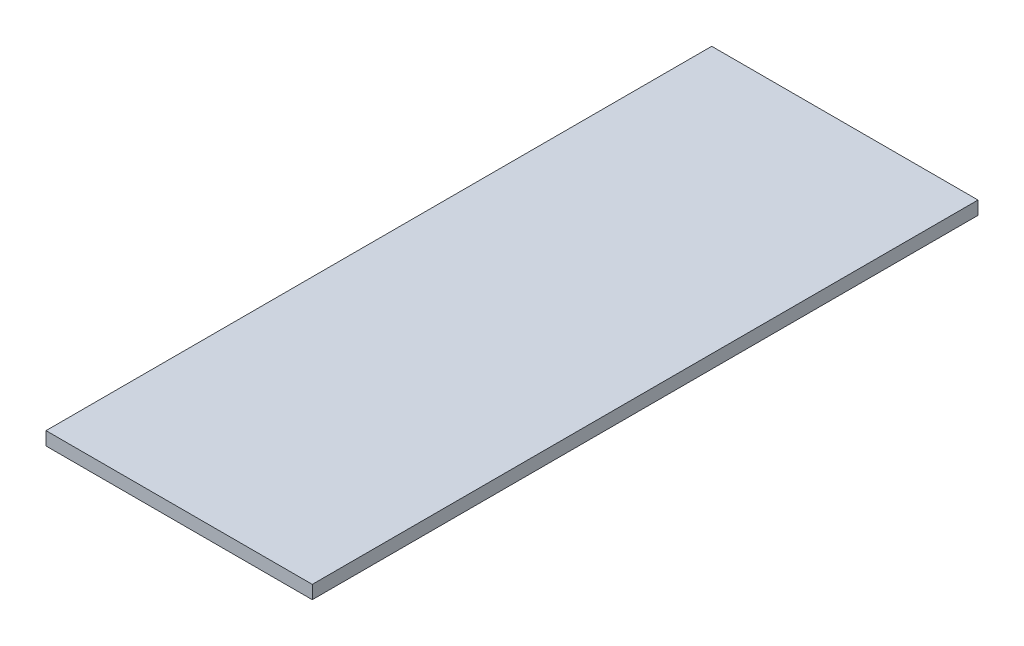
ISO-10303-21;
HEADER;
FILE_DESCRIPTION(('STEP AP214'),'2;1');
FILE_NAME('part.step','',(''),(''),'','','');
FILE_SCHEMA(('AUTOMOTIVE_DESIGN { 1 0 10303 214 1 1 1 1 }'));
ENDSEC;
DATA;
#1=APPLICATION_CONTEXT('core data for automotive mechanical design processes');
#2=APPLICATION_PROTOCOL_DEFINITION('international standard','automotive_design',2000,#1);
#3=PRODUCT_CONTEXT('',#1,'mechanical');
#4=PRODUCT('Part','Part','',(#3));
#5=PRODUCT_RELATED_PRODUCT_CATEGORY('part','',(#4));
#6=PRODUCT_DEFINITION_FORMATION('','',#4);
#7=PRODUCT_DEFINITION_CONTEXT('part definition',#1,'design');
#8=PRODUCT_DEFINITION('design','',#6,#7);
#9=PRODUCT_DEFINITION_SHAPE('','',#8);
#10=(LENGTH_UNIT() NAMED_UNIT(*) SI_UNIT(.MILLI.,.METRE.));
#11=(NAMED_UNIT(*) PLANE_ANGLE_UNIT() SI_UNIT($,.RADIAN.));
#12=(NAMED_UNIT(*) SI_UNIT($,.STERADIAN.) SOLID_ANGLE_UNIT());
#13=UNCERTAINTY_MEASURE_WITH_UNIT(LENGTH_MEASURE(1.E-05),#10,'distance_accuracy_value','');
#14=(GEOMETRIC_REPRESENTATION_CONTEXT(3) GLOBAL_UNCERTAINTY_ASSIGNED_CONTEXT((#13)) GLOBAL_UNIT_ASSIGNED_CONTEXT((#10,
#11,#12)) REPRESENTATION_CONTEXT('',''));
#15=CARTESIAN_POINT('',(0.,0.,0.));
#16=DIRECTION('',(0.,0.,1.));
#17=DIRECTION('',(1.,0.,0.));
#18=AXIS2_PLACEMENT_3D('',#15,#16,#17);
#19=CARTESIAN_POINT('',(200.,0.,-500.));
#20=DIRECTION('',(0.,1.,0.));
#21=DIRECTION('',(0.,0.,-1.));
#22=AXIS2_PLACEMENT_3D('',#19,#20,#21);
#23=CONICAL_SURFACE('',#22,20.,0.20943951023932);
#24=CARTESIAN_POINT('',(200.,0.,-500.));
#25=DIRECTION('',(0.,-1.,0.));
#26=DIRECTION('',(0.,0.,-1.));
#27=AXIS2_PLACEMENT_3D('',#24,#25,#26);
#28=CIRCLE('',#27,20.);
#29=CARTESIAN_POINT('',(200.,0.,-520.));
#30=VERTEX_POINT('',#29);
#31=EDGE_CURVE('E102',#30,#30,#28,.T.);
#32=ORIENTED_EDGE('',*,*,#31,.T.);
#33=EDGE_LOOP('',(#32));
#34=FACE_BOUND('',#33,.T.);
#35=CARTESIAN_POINT('',(200.,-48.5430515819987,-500.));
#36=DIRECTION('',(0.,-1.,0.));
#37=DIRECTION('',(0.,0.,-1.));
#38=AXIS2_PLACEMENT_3D('',#35,#36,#37);
#39=CIRCLE('',#38,9.68185586275983);
#40=CARTESIAN_POINT('',(200.,-48.5430515819987,-509.68185586276));
#41=VERTEX_POINT('',#40);
#42=EDGE_CURVE('E11',#41,#41,#39,.T.);
#43=ORIENTED_EDGE('',*,*,#42,.F.);
#44=EDGE_LOOP('',(#43));
#45=FACE_BOUND('',#44,.T.);
#46=ADVANCED_FACE('F32',(#34,#45),#23,.T.);
#47=CARTESIAN_POINT('',(0.,0.,0.));
#48=DIRECTION('',(0.,-1.,0.));
#49=DIRECTION('',(0.,0.,-1.));
#50=AXIS2_PLACEMENT_3D('',#47,#48,#49);
#51=PLANE('',#50);
#52=DIRECTION('',(0.,0.,1.));
#53=VECTOR('',#52,1.);
#54=CARTESIAN_POINT('',(0.,0.,0.));
#55=LINE('',#54,#53);
#56=CARTESIAN_POINT('',(-2.28983498828939E-13,0.,-1000.));
#57=VERTEX_POINT('',#56);
#58=CARTESIAN_POINT('',(0.,0.,0.));
#59=VERTEX_POINT('',#58);
#60=EDGE_CURVE('E99',#57,#59,#55,.T.);
#61=ORIENTED_EDGE('',*,*,#60,.F.);
#62=DIRECTION('',(-1.,0.,0.));
#63=VECTOR('',#62,1.);
#64=CARTESIAN_POINT('',(-2.28983498828939E-13,0.,-1000.));
#65=LINE('',#64,#63);
#66=CARTESIAN_POINT('',(400.,0.,-1000.));
#67=VERTEX_POINT('',#66);
#68=EDGE_CURVE('E72',#67,#57,#65,.T.);
#69=ORIENTED_EDGE('',*,*,#68,.F.);
#70=DIRECTION('',(0.,0.,-1.));
#71=VECTOR('',#70,1.);
#72=CARTESIAN_POINT('',(400.,0.,0.));
#73=LINE('',#72,#71);
#74=CARTESIAN_POINT('',(400.,0.,0.));
#75=VERTEX_POINT('',#74);
#76=EDGE_CURVE('E66',#75,#67,#73,.T.);
#77=ORIENTED_EDGE('',*,*,#76,.F.);
#78=DIRECTION('',(1.,0.,0.));
#79=VECTOR('',#78,1.);
#80=CARTESIAN_POINT('',(0.,0.,0.));
#81=LINE('',#80,#79);
#82=EDGE_CURVE('E90',#59,#75,#81,.T.);
#83=ORIENTED_EDGE('',*,*,#82,.F.);
#84=EDGE_LOOP('',(#61,#69,#77,#83));
#85=FACE_BOUND('',#84,.T.);
#86=ORIENTED_EDGE('',*,*,#31,.F.);
#87=EDGE_LOOP('',(#86));
#88=FACE_BOUND('',#87,.T.);
#89=ADVANCED_FACE('F110',(#85,#88),#51,.T.);
#90=CARTESIAN_POINT('',(0.,20.,0.));
#91=DIRECTION('',(1.,0.,0.));
#92=DIRECTION('',(0.,0.,-1.));
#93=AXIS2_PLACEMENT_3D('',#90,#91,#92);
#94=PLANE('',#93);
#95=ORIENTED_EDGE('',*,*,#60,.T.);
#96=DIRECTION('',(0.,-1.,0.));
#97=VECTOR('',#96,1.);
#98=CARTESIAN_POINT('',(0.,20.,0.));
#99=LINE('',#98,#97);
#100=CARTESIAN_POINT('',(0.,20.,0.));
#101=VERTEX_POINT('',#100);
#102=EDGE_CURVE('E41',#101,#59,#99,.T.);
#103=ORIENTED_EDGE('',*,*,#102,.F.);
#104=DIRECTION('',(0.,0.,1.));
#105=VECTOR('',#104,1.);
#106=CARTESIAN_POINT('',(0.,20.,0.));
#107=LINE('',#106,#105);
#108=CARTESIAN_POINT('',(-2.28983498828939E-13,20.,-1000.));
#109=VERTEX_POINT('',#108);
#110=EDGE_CURVE('E85',#109,#101,#107,.T.);
#111=ORIENTED_EDGE('',*,*,#110,.F.);
#112=DIRECTION('',(0.,-1.,0.));
#113=VECTOR('',#112,1.);
#114=CARTESIAN_POINT('',(-2.28983498828939E-13,20.,-1000.));
#115=LINE('',#114,#113);
#116=EDGE_CURVE('E95',#109,#57,#115,.T.);
#117=ORIENTED_EDGE('',*,*,#116,.T.);
#118=EDGE_LOOP('',(#95,#103,#111,#117));
#119=FACE_BOUND('',#118,.T.);
#120=ADVANCED_FACE('F34',(#119),#94,.F.);
#121=CARTESIAN_POINT('',(0.,20.,0.));
#122=DIRECTION('',(0.,0.,-1.));
#123=DIRECTION('',(-1.,0.,0.));
#124=AXIS2_PLACEMENT_3D('',#121,#122,#123);
#125=PLANE('',#124);
#126=ORIENTED_EDGE('',*,*,#82,.T.);
#127=DIRECTION('',(0.,-1.,0.));
#128=VECTOR('',#127,1.);
#129=CARTESIAN_POINT('',(400.,20.,0.));
#130=LINE('',#129,#128);
#131=CARTESIAN_POINT('',(400.,20.,0.));
#132=VERTEX_POINT('',#131);
#133=EDGE_CURVE('E88',#132,#75,#130,.T.);
#134=ORIENTED_EDGE('',*,*,#133,.F.);
#135=DIRECTION('',(1.,0.,0.));
#136=VECTOR('',#135,1.);
#137=CARTESIAN_POINT('',(0.,20.,0.));
#138=LINE('',#137,#136);
#139=EDGE_CURVE('E80',#101,#132,#138,.T.);
#140=ORIENTED_EDGE('',*,*,#139,.F.);
#141=ORIENTED_EDGE('',*,*,#102,.T.);
#142=EDGE_LOOP('',(#126,#134,#140,#141));
#143=FACE_BOUND('',#142,.T.);
#144=ADVANCED_FACE('F89',(#143),#125,.F.);
#145=CARTESIAN_POINT('',(400.,20.,0.));
#146=DIRECTION('',(-1.,0.,0.));
#147=DIRECTION('',(0.,0.,1.));
#148=AXIS2_PLACEMENT_3D('',#145,#146,#147);
#149=PLANE('',#148);
#150=ORIENTED_EDGE('',*,*,#76,.T.);
#151=DIRECTION('',(0.,-1.,0.));
#152=VECTOR('',#151,1.);
#153=CARTESIAN_POINT('',(400.,20.,-1000.));
#154=LINE('',#153,#152);
#155=CARTESIAN_POINT('',(400.,20.,-1000.));
#156=VERTEX_POINT('',#155);
#157=EDGE_CURVE('E91',#156,#67,#154,.T.);
#158=ORIENTED_EDGE('',*,*,#157,.F.);
#159=DIRECTION('',(0.,0.,-1.));
#160=VECTOR('',#159,1.);
#161=CARTESIAN_POINT('',(400.,20.,0.));
#162=LINE('',#161,#160);
#163=EDGE_CURVE('E83',#132,#156,#162,.T.);
#164=ORIENTED_EDGE('',*,*,#163,.F.);
#165=ORIENTED_EDGE('',*,*,#133,.T.);
#166=EDGE_LOOP('',(#150,#158,#164,#165));
#167=FACE_BOUND('',#166,.T.);
#168=ADVANCED_FACE('F93',(#167),#149,.F.);
#169=CARTESIAN_POINT('',(-2.28983498828939E-13,20.,-1000.));
#170=DIRECTION('',(0.,0.,1.));
#171=DIRECTION('',(1.,0.,0.));
#172=AXIS2_PLACEMENT_3D('',#169,#170,#171);
#173=PLANE('',#172);
#174=ORIENTED_EDGE('',*,*,#68,.T.);
#175=ORIENTED_EDGE('',*,*,#116,.F.);
#176=DIRECTION('',(-1.,0.,0.));
#177=VECTOR('',#176,1.);
#178=CARTESIAN_POINT('',(-2.28983498828939E-13,20.,-1000.));
#179=LINE('',#178,#177);
#180=EDGE_CURVE('E49',#156,#109,#179,.T.);
#181=ORIENTED_EDGE('',*,*,#180,.F.);
#182=ORIENTED_EDGE('',*,*,#157,.T.);
#183=EDGE_LOOP('',(#174,#175,#181,#182));
#184=FACE_BOUND('',#183,.T.);
#185=ADVANCED_FACE('F129',(#184),#173,.F.);
#186=CARTESIAN_POINT('',(0.,20.,0.));
#187=DIRECTION('',(0.,-1.,0.));
#188=DIRECTION('',(0.,0.,-1.));
#189=AXIS2_PLACEMENT_3D('',#186,#187,#188);
#190=PLANE('',#189);
#191=ORIENTED_EDGE('',*,*,#110,.T.);
#192=ORIENTED_EDGE('',*,*,#139,.T.);
#193=ORIENTED_EDGE('',*,*,#163,.T.);
#194=ORIENTED_EDGE('',*,*,#180,.T.);
#195=EDGE_LOOP('',(#191,#192,#193,#194));
#196=FACE_BOUND('',#195,.T.);
#197=ADVANCED_FACE('F81',(#196),#190,.F.);
#198=CARTESIAN_POINT('',(200.,-60.,-500.));
#199=DIRECTION('',(0.,0.,1.));
#200=DIRECTION('',(0.,1.,0.));
#201=AXIS2_PLACEMENT_3D('',#198,#199,#200);
#202=SPHERICAL_SURFACE('',#201,15.);
#203=CARTESIAN_POINT('',(200.,-60.,-500.));
#204=DIRECTION('',(0.,-1.,0.));
#205=DIRECTION('',(0.,0.,-1.));
#206=AXIS2_PLACEMENT_3D('',#203,#204,#205);
#207=SPHERICAL_SURFACE('',#206,15.);
#208=ORIENTED_EDGE('',*,*,#42,.T.);
#209=EDGE_LOOP('',(#208));
#210=FACE_BOUND('',#209,.T.);
#211=ADVANCED_FACE('F123',(#210),#207,.T.);
#212=CLOSED_SHELL('',(#46,#89,#120,#144,#168,#185,#197,#211));
#213=MANIFOLD_SOLID_BREP('B2',#212);
#214=ADVANCED_BREP_SHAPE_REPRESENTATION('',(#18,#213),#14);
#215=SHAPE_DEFINITION_REPRESENTATION(#9,#214);
ENDSEC;
END-ISO-10303-21;
